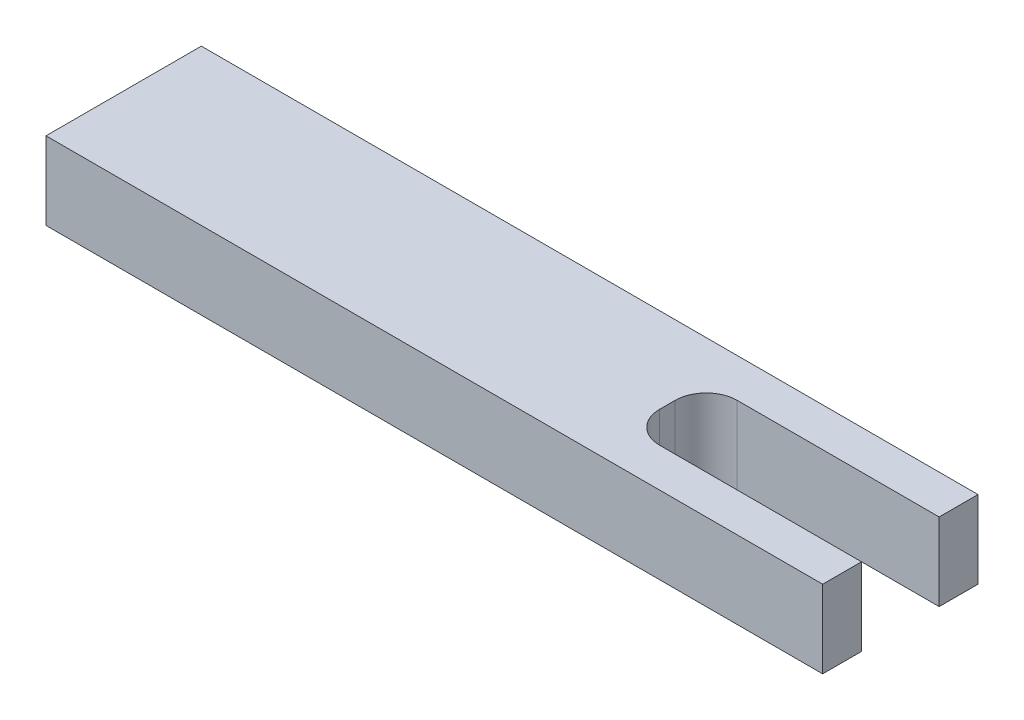
ISO-10303-21;
HEADER;
FILE_DESCRIPTION(('STEP AP214'),'2;1');
FILE_NAME('part.step','',(''),(''),'','','');
FILE_SCHEMA(('AUTOMOTIVE_DESIGN { 1 0 10303 214 1 1 1 1 }'));
ENDSEC;
DATA;
#1=APPLICATION_CONTEXT('core data for automotive mechanical design processes');
#2=APPLICATION_PROTOCOL_DEFINITION('international standard','automotive_design',2000,#1);
#3=PRODUCT_CONTEXT('',#1,'mechanical');
#4=PRODUCT('Part','Part','',(#3));
#5=PRODUCT_RELATED_PRODUCT_CATEGORY('part','',(#4));
#6=PRODUCT_DEFINITION_FORMATION('','',#4);
#7=PRODUCT_DEFINITION_CONTEXT('part definition',#1,'design');
#8=PRODUCT_DEFINITION('design','',#6,#7);
#9=PRODUCT_DEFINITION_SHAPE('','',#8);
#10=(LENGTH_UNIT() NAMED_UNIT(*) SI_UNIT(.MILLI.,.METRE.));
#11=(NAMED_UNIT(*) PLANE_ANGLE_UNIT() SI_UNIT($,.RADIAN.));
#12=(NAMED_UNIT(*) SI_UNIT($,.STERADIAN.) SOLID_ANGLE_UNIT());
#13=UNCERTAINTY_MEASURE_WITH_UNIT(LENGTH_MEASURE(1.E-05),#10,'distance_accuracy_value','');
#14=(GEOMETRIC_REPRESENTATION_CONTEXT(3) GLOBAL_UNCERTAINTY_ASSIGNED_CONTEXT((#13)) GLOBAL_UNIT_ASSIGNED_CONTEXT((#10,
#11,#12)) REPRESENTATION_CONTEXT('',''));
#15=CARTESIAN_POINT('',(0.,0.,0.));
#16=DIRECTION('',(0.,0.,1.));
#17=DIRECTION('',(1.,0.,0.));
#18=AXIS2_PLACEMENT_3D('',#15,#16,#17);
#19=CARTESIAN_POINT('',(50.,2.5,0.));
#20=DIRECTION('',(-1.,0.,0.));
#21=DIRECTION('',(0.,0.,1.));
#22=AXIS2_PLACEMENT_3D('',#19,#20,#21);
#23=PLANE('',#22);
#24=DIRECTION('',(0.,1.,0.));
#25=VECTOR('',#24,1.);
#26=CARTESIAN_POINT('',(50.,-2.5,-7.5));
#27=LINE('',#26,#25);
#28=CARTESIAN_POINT('',(50.,-2.5,-7.5));
#29=VERTEX_POINT('',#28);
#30=CARTESIAN_POINT('',(50.,2.5,-7.5));
#31=VERTEX_POINT('',#30);
#32=EDGE_CURVE('E134',#29,#31,#27,.T.);
#33=ORIENTED_EDGE('',*,*,#32,.F.);
#34=DIRECTION('',(0.,0.,-1.));
#35=VECTOR('',#34,1.);
#36=CARTESIAN_POINT('',(50.,-2.5,0.));
#37=LINE('',#36,#35);
#38=CARTESIAN_POINT('',(50.,-2.5,-10.));
#39=VERTEX_POINT('',#38);
#40=EDGE_CURVE('E146',#29,#39,#37,.T.);
#41=ORIENTED_EDGE('',*,*,#40,.T.);
#42=DIRECTION('',(0.,-1.,0.));
#43=VECTOR('',#42,1.);
#44=CARTESIAN_POINT('',(50.,2.5,-10.));
#45=LINE('',#44,#43);
#46=CARTESIAN_POINT('',(50.,2.5,-10.));
#47=VERTEX_POINT('',#46);
#48=EDGE_CURVE('E171',#47,#39,#45,.T.);
#49=ORIENTED_EDGE('',*,*,#48,.F.);
#50=DIRECTION('',(0.,0.,-1.));
#51=VECTOR('',#50,1.);
#52=CARTESIAN_POINT('',(50.,2.5,0.));
#53=LINE('',#52,#51);
#54=EDGE_CURVE('E148',#31,#47,#53,.T.);
#55=ORIENTED_EDGE('',*,*,#54,.F.);
#56=EDGE_LOOP('',(#33,#41,#49,#55));
#57=FACE_BOUND('',#56,.T.);
#58=ADVANCED_FACE('F44',(#57),#23,.F.);
#59=CARTESIAN_POINT('',(0.,2.5,0.));
#60=DIRECTION('',(0.,-1.,0.));
#61=DIRECTION('',(0.,0.,-1.));
#62=AXIS2_PLACEMENT_3D('',#59,#60,#61);
#63=PLANE('',#62);
#64=DIRECTION('',(-1.,0.,0.));
#65=VECTOR('',#64,1.);
#66=CARTESIAN_POINT('',(50.,2.5,-7.5));
#67=LINE('',#66,#65);
#68=CARTESIAN_POINT('',(37.,2.5,-7.5));
#69=VERTEX_POINT('',#68);
#70=EDGE_CURVE('E193',#31,#69,#67,.T.);
#71=ORIENTED_EDGE('',*,*,#70,.F.);
#72=ORIENTED_EDGE('',*,*,#54,.T.);
#73=DIRECTION('',(-1.,0.,0.));
#74=VECTOR('',#73,1.);
#75=CARTESIAN_POINT('',(0.,2.5,-10.));
#76=LINE('',#75,#74);
#77=CARTESIAN_POINT('',(0.,2.5,-10.));
#78=VERTEX_POINT('',#77);
#79=EDGE_CURVE('E68',#47,#78,#76,.T.);
#80=ORIENTED_EDGE('',*,*,#79,.T.);
#81=DIRECTION('',(0.,0.,1.));
#82=VECTOR('',#81,1.);
#83=CARTESIAN_POINT('',(0.,2.5,0.));
#84=LINE('',#83,#82);
#85=CARTESIAN_POINT('',(0.,2.5,0.));
#86=VERTEX_POINT('',#85);
#87=EDGE_CURVE('E170',#78,#86,#84,.T.);
#88=ORIENTED_EDGE('',*,*,#87,.T.);
#89=DIRECTION('',(1.,0.,0.));
#90=VECTOR('',#89,1.);
#91=CARTESIAN_POINT('',(0.,2.5,0.));
#92=LINE('',#91,#90);
#93=CARTESIAN_POINT('',(50.,2.5,0.));
#94=VERTEX_POINT('',#93);
#95=EDGE_CURVE('E97',#86,#94,#92,.T.);
#96=ORIENTED_EDGE('',*,*,#95,.T.);
#97=CARTESIAN_POINT('',(50.,2.5,-2.5));
#98=VERTEX_POINT('',#97);
#99=EDGE_CURVE('E183',#94,#98,#53,.T.);
#100=ORIENTED_EDGE('',*,*,#99,.T.);
#101=DIRECTION('',(1.,0.,0.));
#102=VECTOR('',#101,1.);
#103=CARTESIAN_POINT('',(50.,2.5,-2.5));
#104=LINE('',#103,#102);
#105=CARTESIAN_POINT('',(37.,2.5,-2.5));
#106=VERTEX_POINT('',#105);
#107=EDGE_CURVE('E143',#106,#98,#104,.T.);
#108=ORIENTED_EDGE('',*,*,#107,.F.);
#109=CARTESIAN_POINT('',(37.,2.5,-4.5));
#110=DIRECTION('',(0.,1.,0.));
#111=DIRECTION('',(0.,0.,-1.));
#112=AXIS2_PLACEMENT_3D('',#109,#110,#111);
#113=CIRCLE('',#112,2.);
#114=CARTESIAN_POINT('',(35.,2.5,-4.50000000000002));
#115=VERTEX_POINT('',#114);
#116=EDGE_CURVE('E208',#115,#106,#113,.T.);
#117=ORIENTED_EDGE('',*,*,#116,.F.);
#118=DIRECTION('',(0.,0.,1.));
#119=VECTOR('',#118,1.);
#120=CARTESIAN_POINT('',(35.,2.5,-5.49999999999998));
#121=LINE('',#120,#119);
#122=CARTESIAN_POINT('',(35.,2.5,-5.49999999999998));
#123=VERTEX_POINT('',#122);
#124=EDGE_CURVE('E205',#123,#115,#121,.T.);
#125=ORIENTED_EDGE('',*,*,#124,.F.);
#126=CARTESIAN_POINT('',(37.,2.5,-5.5));
#127=DIRECTION('',(0.,1.,0.));
#128=DIRECTION('',(0.,0.,1.));
#129=AXIS2_PLACEMENT_3D('',#126,#127,#128);
#130=CIRCLE('',#129,2.);
#131=EDGE_CURVE('E196',#69,#123,#130,.T.);
#132=ORIENTED_EDGE('',*,*,#131,.F.);
#133=EDGE_LOOP('',(#71,#72,#80,#88,#96,#100,#108,#117,#125,#132));
#134=FACE_BOUND('',#133,.T.);
#135=ADVANCED_FACE('F251',(#134),#63,.F.);
#136=CARTESIAN_POINT('',(0.,-2.5,0.));
#137=DIRECTION('',(0.,-1.,0.));
#138=DIRECTION('',(0.,0.,-1.));
#139=AXIS2_PLACEMENT_3D('',#136,#137,#138);
#140=PLANE('',#139);
#141=CARTESIAN_POINT('',(37.,-2.5,-4.5));
#142=DIRECTION('',(0.,1.,0.));
#143=DIRECTION('',(0.,0.,-1.));
#144=AXIS2_PLACEMENT_3D('',#141,#142,#143);
#145=CIRCLE('',#144,2.);
#146=CARTESIAN_POINT('',(35.,-2.5,-4.50000000000002));
#147=VERTEX_POINT('',#146);
#148=CARTESIAN_POINT('',(37.,-2.5,-2.5));
#149=VERTEX_POINT('',#148);
#150=EDGE_CURVE('E63',#147,#149,#145,.T.);
#151=ORIENTED_EDGE('',*,*,#150,.T.);
#152=DIRECTION('',(1.,0.,0.));
#153=VECTOR('',#152,1.);
#154=CARTESIAN_POINT('',(50.,-2.5,-2.5));
#155=LINE('',#154,#153);
#156=CARTESIAN_POINT('',(50.,-2.5,-2.5));
#157=VERTEX_POINT('',#156);
#158=EDGE_CURVE('E155',#149,#157,#155,.T.);
#159=ORIENTED_EDGE('',*,*,#158,.T.);
#160=CARTESIAN_POINT('',(50.,-2.5,0.));
#161=VERTEX_POINT('',#160);
#162=EDGE_CURVE('E160',#161,#157,#37,.T.);
#163=ORIENTED_EDGE('',*,*,#162,.F.);
#164=DIRECTION('',(1.,0.,0.));
#165=VECTOR('',#164,1.);
#166=CARTESIAN_POINT('',(0.,-2.5,0.));
#167=LINE('',#166,#165);
#168=CARTESIAN_POINT('',(0.,-2.5,0.));
#169=VERTEX_POINT('',#168);
#170=EDGE_CURVE('E156',#169,#161,#167,.T.);
#171=ORIENTED_EDGE('',*,*,#170,.F.);
#172=DIRECTION('',(0.,0.,1.));
#173=VECTOR('',#172,1.);
#174=CARTESIAN_POINT('',(0.,-2.5,0.));
#175=LINE('',#174,#173);
#176=CARTESIAN_POINT('',(0.,-2.5,-10.));
#177=VERTEX_POINT('',#176);
#178=EDGE_CURVE('E161',#177,#169,#175,.T.);
#179=ORIENTED_EDGE('',*,*,#178,.F.);
#180=DIRECTION('',(-1.,0.,0.));
#181=VECTOR('',#180,1.);
#182=CARTESIAN_POINT('',(0.,-2.5,-10.));
#183=LINE('',#182,#181);
#184=EDGE_CURVE('E91',#39,#177,#183,.T.);
#185=ORIENTED_EDGE('',*,*,#184,.F.);
#186=ORIENTED_EDGE('',*,*,#40,.F.);
#187=DIRECTION('',(-1.,0.,0.));
#188=VECTOR('',#187,1.);
#189=CARTESIAN_POINT('',(50.,-2.5,-7.5));
#190=LINE('',#189,#188);
#191=CARTESIAN_POINT('',(37.,-2.5,-7.5));
#192=VERTEX_POINT('',#191);
#193=EDGE_CURVE('E131',#29,#192,#190,.T.);
#194=ORIENTED_EDGE('',*,*,#193,.T.);
#195=CARTESIAN_POINT('',(37.,-2.5,-5.5));
#196=DIRECTION('',(0.,1.,0.));
#197=DIRECTION('',(0.,0.,1.));
#198=AXIS2_PLACEMENT_3D('',#195,#196,#197);
#199=CIRCLE('',#198,2.);
#200=CARTESIAN_POINT('',(35.,-2.5,-5.49999999999998));
#201=VERTEX_POINT('',#200);
#202=EDGE_CURVE('E142',#192,#201,#199,.T.);
#203=ORIENTED_EDGE('',*,*,#202,.T.);
#204=DIRECTION('',(0.,0.,1.));
#205=VECTOR('',#204,1.);
#206=CARTESIAN_POINT('',(35.,-2.5,-5.49999999999998));
#207=LINE('',#206,#205);
#208=EDGE_CURVE('E192',#201,#147,#207,.T.);
#209=ORIENTED_EDGE('',*,*,#208,.T.);
#210=EDGE_LOOP('',(#151,#159,#163,#171,#179,#185,#186,#194,#203,#209));
#211=FACE_BOUND('',#210,.T.);
#212=ADVANCED_FACE('F152',(#211),#140,.T.);
#213=CARTESIAN_POINT('',(0.,2.5,0.));
#214=DIRECTION('',(1.,0.,0.));
#215=DIRECTION('',(0.,0.,-1.));
#216=AXIS2_PLACEMENT_3D('',#213,#214,#215);
#217=PLANE('',#216);
#218=ORIENTED_EDGE('',*,*,#178,.T.);
#219=DIRECTION('',(0.,-1.,0.));
#220=VECTOR('',#219,1.);
#221=CARTESIAN_POINT('',(0.,2.5,0.));
#222=LINE('',#221,#220);
#223=EDGE_CURVE('E11',#86,#169,#222,.T.);
#224=ORIENTED_EDGE('',*,*,#223,.F.);
#225=ORIENTED_EDGE('',*,*,#87,.F.);
#226=DIRECTION('',(0.,-1.,0.));
#227=VECTOR('',#226,1.);
#228=CARTESIAN_POINT('',(0.,2.5,-10.));
#229=LINE('',#228,#227);
#230=EDGE_CURVE('E169',#78,#177,#229,.T.);
#231=ORIENTED_EDGE('',*,*,#230,.T.);
#232=EDGE_LOOP('',(#218,#224,#225,#231));
#233=FACE_BOUND('',#232,.T.);
#234=ADVANCED_FACE('F50',(#233),#217,.F.);
#235=CARTESIAN_POINT('',(0.,2.5,0.));
#236=DIRECTION('',(0.,0.,-1.));
#237=DIRECTION('',(-1.,0.,0.));
#238=AXIS2_PLACEMENT_3D('',#235,#236,#237);
#239=PLANE('',#238);
#240=ORIENTED_EDGE('',*,*,#170,.T.);
#241=DIRECTION('',(0.,-1.,0.));
#242=VECTOR('',#241,1.);
#243=CARTESIAN_POINT('',(50.,2.5,0.));
#244=LINE('',#243,#242);
#245=EDGE_CURVE('E53',#94,#161,#244,.T.);
#246=ORIENTED_EDGE('',*,*,#245,.F.);
#247=ORIENTED_EDGE('',*,*,#95,.F.);
#248=ORIENTED_EDGE('',*,*,#223,.T.);
#249=EDGE_LOOP('',(#240,#246,#247,#248));
#250=FACE_BOUND('',#249,.T.);
#251=ADVANCED_FACE('F248',(#250),#239,.F.);
#252=ORIENTED_EDGE('',*,*,#162,.T.);
#253=DIRECTION('',(0.,1.,0.));
#254=VECTOR('',#253,1.);
#255=CARTESIAN_POINT('',(50.,-2.5,-2.5));
#256=LINE('',#255,#254);
#257=EDGE_CURVE('E212',#157,#98,#256,.T.);
#258=ORIENTED_EDGE('',*,*,#257,.T.);
#259=ORIENTED_EDGE('',*,*,#99,.F.);
#260=ORIENTED_EDGE('',*,*,#245,.T.);
#261=EDGE_LOOP('',(#252,#258,#259,#260));
#262=FACE_BOUND('',#261,.T.);
#263=ADVANCED_FACE('F179',(#262),#23,.F.);
#264=CARTESIAN_POINT('',(0.,2.5,-10.));
#265=DIRECTION('',(0.,0.,1.));
#266=DIRECTION('',(1.,0.,0.));
#267=AXIS2_PLACEMENT_3D('',#264,#265,#266);
#268=PLANE('',#267);
#269=ORIENTED_EDGE('',*,*,#184,.T.);
#270=ORIENTED_EDGE('',*,*,#230,.F.);
#271=ORIENTED_EDGE('',*,*,#79,.F.);
#272=ORIENTED_EDGE('',*,*,#48,.T.);
#273=EDGE_LOOP('',(#269,#270,#271,#272));
#274=FACE_BOUND('',#273,.T.);
#275=ADVANCED_FACE('F239',(#274),#268,.F.);
#276=CARTESIAN_POINT('',(50.,-2.5,-2.5));
#277=DIRECTION('',(0.,0.,1.));
#278=DIRECTION('',(1.,0.,0.));
#279=AXIS2_PLACEMENT_3D('',#276,#277,#278);
#280=PLANE('',#279);
#281=ORIENTED_EDGE('',*,*,#107,.T.);
#282=ORIENTED_EDGE('',*,*,#257,.F.);
#283=ORIENTED_EDGE('',*,*,#158,.F.);
#284=DIRECTION('',(0.,1.,0.));
#285=VECTOR('',#284,1.);
#286=CARTESIAN_POINT('',(37.,-2.5,-2.5));
#287=LINE('',#286,#285);
#288=EDGE_CURVE('E214',#149,#106,#287,.T.);
#289=ORIENTED_EDGE('',*,*,#288,.T.);
#290=EDGE_LOOP('',(#281,#282,#283,#289));
#291=FACE_BOUND('',#290,.T.);
#292=ADVANCED_FACE('F238',(#291),#280,.F.);
#293=CARTESIAN_POINT('',(37.,-2.5,-4.5));
#294=DIRECTION('',(0.,1.,0.));
#295=DIRECTION('',(0.,0.,1.));
#296=AXIS2_PLACEMENT_3D('',#293,#294,#295);
#297=CYLINDRICAL_SURFACE('',#296,2.);
#298=ORIENTED_EDGE('',*,*,#116,.T.);
#299=ORIENTED_EDGE('',*,*,#288,.F.);
#300=ORIENTED_EDGE('',*,*,#150,.F.);
#301=DIRECTION('',(0.,1.,0.));
#302=VECTOR('',#301,1.);
#303=CARTESIAN_POINT('',(35.,-2.5,-4.50000000000002));
#304=LINE('',#303,#302);
#305=EDGE_CURVE('E216',#147,#115,#304,.T.);
#306=ORIENTED_EDGE('',*,*,#305,.T.);
#307=EDGE_LOOP('',(#298,#299,#300,#306));
#308=FACE_BOUND('',#307,.T.);
#309=ADVANCED_FACE('F250',(#308),#297,.F.);
#310=CARTESIAN_POINT('',(35.,-2.5,-5.49999999999998));
#311=DIRECTION('',(-1.,0.,0.));
#312=DIRECTION('',(0.,0.,1.));
#313=AXIS2_PLACEMENT_3D('',#310,#311,#312);
#314=PLANE('',#313);
#315=ORIENTED_EDGE('',*,*,#124,.T.);
#316=ORIENTED_EDGE('',*,*,#305,.F.);
#317=ORIENTED_EDGE('',*,*,#208,.F.);
#318=DIRECTION('',(0.,1.,0.));
#319=VECTOR('',#318,1.);
#320=CARTESIAN_POINT('',(35.,-2.5,-5.49999999999998));
#321=LINE('',#320,#319);
#322=EDGE_CURVE('E221',#201,#123,#321,.T.);
#323=ORIENTED_EDGE('',*,*,#322,.T.);
#324=EDGE_LOOP('',(#315,#316,#317,#323));
#325=FACE_BOUND('',#324,.T.);
#326=ADVANCED_FACE('F275',(#325),#314,.F.);
#327=CARTESIAN_POINT('',(37.,-2.5,-5.5));
#328=DIRECTION('',(0.,1.,0.));
#329=DIRECTION('',(0.,0.,1.));
#330=AXIS2_PLACEMENT_3D('',#327,#328,#329);
#331=CYLINDRICAL_SURFACE('',#330,2.);
#332=ORIENTED_EDGE('',*,*,#131,.T.);
#333=ORIENTED_EDGE('',*,*,#322,.F.);
#334=ORIENTED_EDGE('',*,*,#202,.F.);
#335=DIRECTION('',(0.,1.,0.));
#336=VECTOR('',#335,1.);
#337=CARTESIAN_POINT('',(37.,-2.5,-7.5));
#338=LINE('',#337,#336);
#339=EDGE_CURVE('E140',#192,#69,#338,.T.);
#340=ORIENTED_EDGE('',*,*,#339,.T.);
#341=EDGE_LOOP('',(#332,#333,#334,#340));
#342=FACE_BOUND('',#341,.T.);
#343=ADVANCED_FACE('F267',(#342),#331,.F.);
#344=CARTESIAN_POINT('',(50.,-2.5,-7.5));
#345=DIRECTION('',(0.,0.,-1.));
#346=DIRECTION('',(-1.,0.,0.));
#347=AXIS2_PLACEMENT_3D('',#344,#345,#346);
#348=PLANE('',#347);
#349=ORIENTED_EDGE('',*,*,#70,.T.);
#350=ORIENTED_EDGE('',*,*,#339,.F.);
#351=ORIENTED_EDGE('',*,*,#193,.F.);
#352=ORIENTED_EDGE('',*,*,#32,.T.);
#353=EDGE_LOOP('',(#349,#350,#351,#352));
#354=FACE_BOUND('',#353,.T.);
#355=ADVANCED_FACE('F132',(#354),#348,.F.);
#356=CLOSED_SHELL('',(#58,#135,#212,#234,#251,#263,#275,#292,#309,#326,#343,#355));
#357=MANIFOLD_SOLID_BREP('B2',#356);
#358=ADVANCED_BREP_SHAPE_REPRESENTATION('',(#18,#357),#14);
#359=SHAPE_DEFINITION_REPRESENTATION(#9,#358);
ENDSEC;
END-ISO-10303-21;
